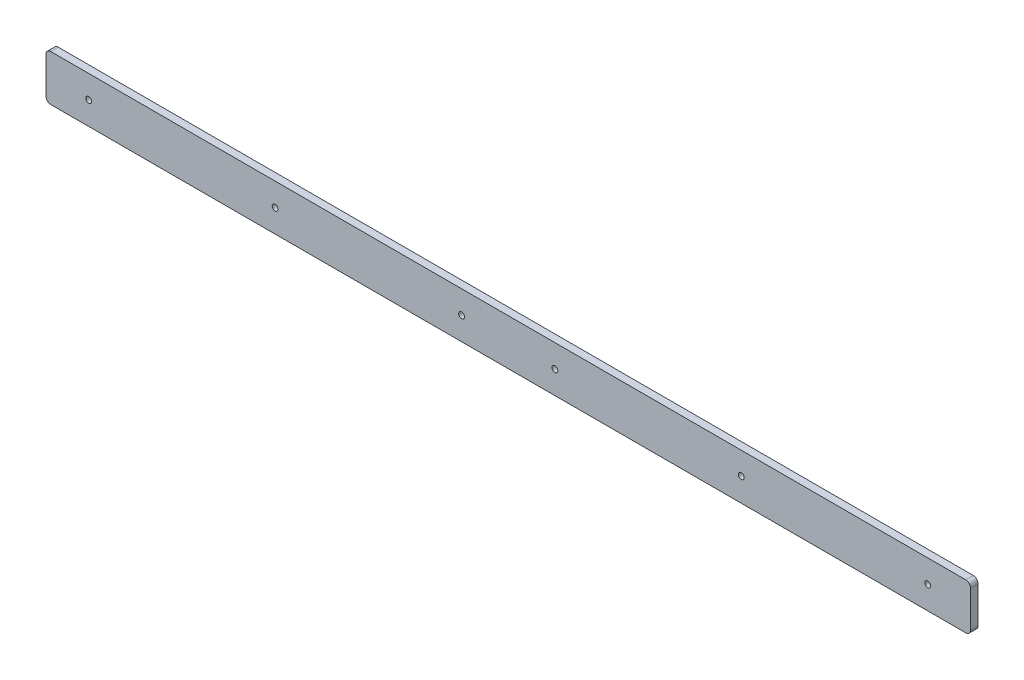
ISO-10303-21;
HEADER;
FILE_DESCRIPTION(('STEP AP214'),'2;1');
FILE_NAME('part.step','',(''),(''),'','','');
FILE_SCHEMA(('AUTOMOTIVE_DESIGN { 1 0 10303 214 1 1 1 1 }'));
ENDSEC;
DATA;
#1=APPLICATION_CONTEXT('core data for automotive mechanical design processes');
#2=APPLICATION_PROTOCOL_DEFINITION('international standard','automotive_design',2000,#1);
#3=PRODUCT_CONTEXT('',#1,'mechanical');
#4=PRODUCT('Part','Part','',(#3));
#5=PRODUCT_RELATED_PRODUCT_CATEGORY('part','',(#4));
#6=PRODUCT_DEFINITION_FORMATION('','',#4);
#7=PRODUCT_DEFINITION_CONTEXT('part definition',#1,'design');
#8=PRODUCT_DEFINITION('design','',#6,#7);
#9=PRODUCT_DEFINITION_SHAPE('','',#8);
#10=(LENGTH_UNIT() NAMED_UNIT(*) SI_UNIT(.MILLI.,.METRE.));
#11=(NAMED_UNIT(*) PLANE_ANGLE_UNIT() SI_UNIT($,.RADIAN.));
#12=(NAMED_UNIT(*) SI_UNIT($,.STERADIAN.) SOLID_ANGLE_UNIT());
#13=UNCERTAINTY_MEASURE_WITH_UNIT(LENGTH_MEASURE(1.E-05),#10,'distance_accuracy_value','');
#14=(GEOMETRIC_REPRESENTATION_CONTEXT(3) GLOBAL_UNCERTAINTY_ASSIGNED_CONTEXT((#13)) GLOBAL_UNIT_ASSIGNED_CONTEXT((#10,
#11,#12)) REPRESENTATION_CONTEXT('',''));
#15=CARTESIAN_POINT('',(0.,0.,0.));
#16=DIRECTION('',(0.,0.,1.));
#17=DIRECTION('',(1.,0.,0.));
#18=AXIS2_PLACEMENT_3D('',#15,#16,#17);
#19=CARTESIAN_POINT('',(0.,0.,1.6002));
#20=DIRECTION('',(-1.,0.,0.));
#21=DIRECTION('',(0.,0.,1.));
#22=AXIS2_PLACEMENT_3D('',#19,#20,#21);
#23=PLANE('',#22);
#24=DIRECTION('',(0.,1.,0.));
#25=VECTOR('',#24,1.);
#26=CARTESIAN_POINT('',(0.,0.,0.));
#27=LINE('',#26,#25);
#28=CARTESIAN_POINT('',(0.,1.,0.));
#29=VERTEX_POINT('',#28);
#30=CARTESIAN_POINT('',(0.,8.757695242,0.));
#31=VERTEX_POINT('',#30);
#32=EDGE_CURVE('E132',#29,#31,#27,.T.);
#33=ORIENTED_EDGE('',*,*,#32,.F.);
#34=DIRECTION('',(0.,0.,-1.));
#35=VECTOR('',#34,1.);
#36=CARTESIAN_POINT('',(0.,1.,1.6002));
#37=LINE('',#36,#35);
#38=CARTESIAN_POINT('',(0.,1.,1.6002));
#39=VERTEX_POINT('',#38);
#40=EDGE_CURVE('E11',#29,#39,#37,.F.);
#41=ORIENTED_EDGE('',*,*,#40,.T.);
#42=DIRECTION('',(0.,1.,0.));
#43=VECTOR('',#42,1.);
#44=CARTESIAN_POINT('',(0.,0.,1.6002));
#45=LINE('',#44,#43);
#46=CARTESIAN_POINT('',(0.,8.757695242,1.6002));
#47=VERTEX_POINT('',#46);
#48=EDGE_CURVE('E130',#39,#47,#45,.T.);
#49=ORIENTED_EDGE('',*,*,#48,.T.);
#50=DIRECTION('',(0.,0.,-1.));
#51=VECTOR('',#50,1.);
#52=CARTESIAN_POINT('',(0.,8.757695242,1.6002));
#53=LINE('',#52,#51);
#54=EDGE_CURVE('E44',#47,#31,#53,.T.);
#55=ORIENTED_EDGE('',*,*,#54,.T.);
#56=EDGE_LOOP('',(#33,#41,#49,#55));
#57=FACE_BOUND('',#56,.T.);
#58=ADVANCED_FACE('F36',(#57),#23,.T.);
#59=CARTESIAN_POINT('',(0.,0.,1.6002));
#60=DIRECTION('',(0.,1.,0.));
#61=DIRECTION('',(0.,0.,1.));
#62=AXIS2_PLACEMENT_3D('',#59,#60,#61);
#63=PLANE('',#62);
#64=DIRECTION('',(1.,0.,0.));
#65=VECTOR('',#64,1.);
#66=CARTESIAN_POINT('',(0.,0.,0.));
#67=LINE('',#66,#65);
#68=CARTESIAN_POINT('',(1.,0.,0.));
#69=VERTEX_POINT('',#68);
#70=CARTESIAN_POINT('',(195.457160044,0.,0.));
#71=VERTEX_POINT('',#70);
#72=EDGE_CURVE('E127',#69,#71,#67,.T.);
#73=ORIENTED_EDGE('',*,*,#72,.T.);
#74=DIRECTION('',(0.,0.,-1.));
#75=VECTOR('',#74,1.);
#76=CARTESIAN_POINT('',(195.457160044,0.,1.6002));
#77=LINE('',#76,#75);
#78=CARTESIAN_POINT('',(195.457160044,0.,1.6002));
#79=VERTEX_POINT('',#78);
#80=EDGE_CURVE('E107',#71,#79,#77,.F.);
#81=ORIENTED_EDGE('',*,*,#80,.T.);
#82=DIRECTION('',(1.,0.,0.));
#83=VECTOR('',#82,1.);
#84=CARTESIAN_POINT('',(0.,0.,1.6002));
#85=LINE('',#84,#83);
#86=CARTESIAN_POINT('',(1.,0.,1.6002));
#87=VERTEX_POINT('',#86);
#88=EDGE_CURVE('E136',#87,#79,#85,.T.);
#89=ORIENTED_EDGE('',*,*,#88,.F.);
#90=DIRECTION('',(0.,0.,-1.));
#91=VECTOR('',#90,1.);
#92=CARTESIAN_POINT('',(1.,0.,0.));
#93=LINE('',#92,#91);
#94=EDGE_CURVE('E112',#87,#69,#93,.T.);
#95=ORIENTED_EDGE('',*,*,#94,.T.);
#96=EDGE_LOOP('',(#73,#81,#89,#95));
#97=FACE_BOUND('',#96,.T.);
#98=ADVANCED_FACE('F229',(#97),#63,.F.);
#99=CARTESIAN_POINT('',(196.457160044,0.,1.6002));
#100=DIRECTION('',(-1.,0.,0.));
#101=DIRECTION('',(0.,0.,1.));
#102=AXIS2_PLACEMENT_3D('',#99,#100,#101);
#103=PLANE('',#102);
#104=DIRECTION('',(0.,1.,0.));
#105=VECTOR('',#104,1.);
#106=CARTESIAN_POINT('',(196.457160044,0.,1.6002));
#107=LINE('',#106,#105);
#108=CARTESIAN_POINT('',(196.457160044,1.,1.6002));
#109=VERTEX_POINT('',#108);
#110=CARTESIAN_POINT('',(196.457160044,8.757695242,1.6002));
#111=VERTEX_POINT('',#110);
#112=EDGE_CURVE('E121',#109,#111,#107,.T.);
#113=ORIENTED_EDGE('',*,*,#112,.F.);
#114=DIRECTION('',(0.,0.,-1.));
#115=VECTOR('',#114,1.);
#116=CARTESIAN_POINT('',(196.457160044,1.,1.6002));
#117=LINE('',#116,#115);
#118=CARTESIAN_POINT('',(196.457160044,1.,0.));
#119=VERTEX_POINT('',#118);
#120=EDGE_CURVE('E106',#109,#119,#117,.T.);
#121=ORIENTED_EDGE('',*,*,#120,.T.);
#122=DIRECTION('',(0.,1.,0.));
#123=VECTOR('',#122,1.);
#124=CARTESIAN_POINT('',(196.457160044,0.,0.));
#125=LINE('',#124,#123);
#126=CARTESIAN_POINT('',(196.457160044,8.757695242,0.));
#127=VERTEX_POINT('',#126);
#128=EDGE_CURVE('E119',#119,#127,#125,.T.);
#129=ORIENTED_EDGE('',*,*,#128,.T.);
#130=DIRECTION('',(0.,0.,-1.));
#131=VECTOR('',#130,1.);
#132=CARTESIAN_POINT('',(196.457160044,8.757695242,1.6002));
#133=LINE('',#132,#131);
#134=EDGE_CURVE('E123',#127,#111,#133,.F.);
#135=ORIENTED_EDGE('',*,*,#134,.T.);
#136=EDGE_LOOP('',(#113,#121,#129,#135));
#137=FACE_BOUND('',#136,.T.);
#138=ADVANCED_FACE('F118',(#137),#103,.F.);
#139=CARTESIAN_POINT('',(0.,9.757695242,1.6002));
#140=DIRECTION('',(0.,1.,0.));
#141=DIRECTION('',(0.,0.,1.));
#142=AXIS2_PLACEMENT_3D('',#139,#140,#141);
#143=PLANE('',#142);
#144=DIRECTION('',(1.,0.,0.));
#145=VECTOR('',#144,1.);
#146=CARTESIAN_POINT('',(0.,9.757695242,1.6002));
#147=LINE('',#146,#145);
#148=CARTESIAN_POINT('',(1.,9.757695242,1.6002));
#149=VERTEX_POINT('',#148);
#150=CARTESIAN_POINT('',(195.457160044,9.757695242,1.6002));
#151=VERTEX_POINT('',#150);
#152=EDGE_CURVE('E173',#149,#151,#147,.T.);
#153=ORIENTED_EDGE('',*,*,#152,.T.);
#154=DIRECTION('',(0.,0.,-1.));
#155=VECTOR('',#154,1.);
#156=CARTESIAN_POINT('',(195.457160044,9.757695242,0.));
#157=LINE('',#156,#155);
#158=CARTESIAN_POINT('',(195.457160044,9.757695242,0.));
#159=VERTEX_POINT('',#158);
#160=EDGE_CURVE('E153',#151,#159,#157,.T.);
#161=ORIENTED_EDGE('',*,*,#160,.T.);
#162=DIRECTION('',(1.,0.,0.));
#163=VECTOR('',#162,1.);
#164=CARTESIAN_POINT('',(0.,9.757695242,0.));
#165=LINE('',#164,#163);
#166=CARTESIAN_POINT('',(1.,9.757695242,0.));
#167=VERTEX_POINT('',#166);
#168=EDGE_CURVE('E128',#167,#159,#165,.T.);
#169=ORIENTED_EDGE('',*,*,#168,.F.);
#170=DIRECTION('',(0.,0.,-1.));
#171=VECTOR('',#170,1.);
#172=CARTESIAN_POINT('',(1.,9.757695242,1.6002));
#173=LINE('',#172,#171);
#174=EDGE_CURVE('E58',#167,#149,#173,.F.);
#175=ORIENTED_EDGE('',*,*,#174,.T.);
#176=EDGE_LOOP('',(#153,#161,#169,#175));
#177=FACE_BOUND('',#176,.T.);
#178=ADVANCED_FACE('F214',(#177),#143,.T.);
#179=CARTESIAN_POINT('',(0.,0.,1.6002));
#180=DIRECTION('',(0.,0.,-1.));
#181=DIRECTION('',(-1.,0.,0.));
#182=AXIS2_PLACEMENT_3D('',#179,#180,#181);
#183=PLANE('',#182);
#184=CARTESIAN_POINT('',(9.074999884,4.878847621,1.6002));
#185=DIRECTION('',(0.,0.,1.));
#186=DIRECTION('',(1.,0.,0.));
#187=AXIS2_PLACEMENT_3D('',#184,#185,#186);
#188=CIRCLE('',#187,0.625000000000001);
#189=CARTESIAN_POINT('',(9.699999884,4.878847621,1.6002));
#190=VERTEX_POINT('',#189);
#191=EDGE_CURVE('E167',#190,#190,#188,.T.);
#192=ORIENTED_EDGE('',*,*,#191,.F.);
#193=EDGE_LOOP('',(#192));
#194=FACE_BOUND('',#193,.T.);
#195=CARTESIAN_POINT('',(108.13416016,4.878847621,1.6002));
#196=DIRECTION('',(0.,0.,1.));
#197=DIRECTION('',(1.,0.,0.));
#198=AXIS2_PLACEMENT_3D('',#195,#196,#197);
#199=CIRCLE('',#198,0.62500002);
#200=CARTESIAN_POINT('',(108.75916018,4.878847621,1.6002));
#201=VERTEX_POINT('',#200);
#202=EDGE_CURVE('E201',#201,#201,#199,.T.);
#203=ORIENTED_EDGE('',*,*,#202,.F.);
#204=EDGE_LOOP('',(#203));
#205=FACE_BOUND('',#204,.T.);
#206=CARTESIAN_POINT('',(48.698999884,4.878847621,1.6002));
#207=DIRECTION('',(0.,0.,1.));
#208=DIRECTION('',(1.,0.,0.));
#209=AXIS2_PLACEMENT_3D('',#206,#207,#208);
#210=CIRCLE('',#209,0.624999999999999);
#211=CARTESIAN_POINT('',(49.323999884,4.878847621,1.6002));
#212=VERTEX_POINT('',#211);
#213=EDGE_CURVE('E183',#212,#212,#210,.T.);
#214=ORIENTED_EDGE('',*,*,#213,.F.);
#215=EDGE_LOOP('',(#214));
#216=FACE_BOUND('',#215,.T.);
#217=CARTESIAN_POINT('',(187.38216016,4.878847621,1.6002));
#218=DIRECTION('',(0.,0.,1.));
#219=DIRECTION('',(1.,0.,0.));
#220=AXIS2_PLACEMENT_3D('',#217,#218,#219);
#221=CIRCLE('',#220,0.625000019999999);
#222=CARTESIAN_POINT('',(188.00716018,4.878847621,1.6002));
#223=VERTEX_POINT('',#222);
#224=EDGE_CURVE('E176',#223,#223,#221,.T.);
#225=ORIENTED_EDGE('',*,*,#224,.F.);
#226=EDGE_LOOP('',(#225));
#227=FACE_BOUND('',#226,.T.);
#228=CARTESIAN_POINT('',(88.323000138,4.878847621,1.6002));
#229=DIRECTION('',(0.,0.,1.));
#230=DIRECTION('',(1.,0.,0.));
#231=AXIS2_PLACEMENT_3D('',#228,#229,#230);
#232=CIRCLE('',#231,0.625000000000006);
#233=CARTESIAN_POINT('',(88.948000138,4.878847621,1.6002));
#234=VERTEX_POINT('',#233);
#235=EDGE_CURVE('E196',#234,#234,#232,.T.);
#236=ORIENTED_EDGE('',*,*,#235,.F.);
#237=EDGE_LOOP('',(#236));
#238=FACE_BOUND('',#237,.T.);
#239=CARTESIAN_POINT('',(147.75816016,5.00253651629322,1.6002));
#240=DIRECTION('',(0.,0.,1.));
#241=DIRECTION('',(1.,0.,0.));
#242=AXIS2_PLACEMENT_3D('',#239,#240,#241);
#243=CIRCLE('',#242,0.625000019999999);
#244=CARTESIAN_POINT('',(148.38316018,5.00253651629322,1.6002));
#245=VERTEX_POINT('',#244);
#246=EDGE_CURVE('E189',#245,#245,#243,.T.);
#247=ORIENTED_EDGE('',*,*,#246,.F.);
#248=EDGE_LOOP('',(#247));
#249=FACE_BOUND('',#248,.T.);
#250=ORIENTED_EDGE('',*,*,#88,.T.);
#251=CARTESIAN_POINT('',(195.457160044,1.,1.6002));
#252=DIRECTION('',(0.,0.,-1.));
#253=DIRECTION('',(-1.,0.,0.));
#254=AXIS2_PLACEMENT_3D('',#251,#252,#253);
#255=CIRCLE('',#254,1.);
#256=EDGE_CURVE('E150',#79,#109,#255,.F.);
#257=ORIENTED_EDGE('',*,*,#256,.T.);
#258=ORIENTED_EDGE('',*,*,#112,.T.);
#259=CARTESIAN_POINT('',(195.457160044,8.757695242,1.6002));
#260=DIRECTION('',(0.,0.,-1.));
#261=DIRECTION('',(-1.,0.,0.));
#262=AXIS2_PLACEMENT_3D('',#259,#260,#261);
#263=CIRCLE('',#262,1.);
#264=EDGE_CURVE('E51',#111,#151,#263,.F.);
#265=ORIENTED_EDGE('',*,*,#264,.T.);
#266=ORIENTED_EDGE('',*,*,#152,.F.);
#267=CARTESIAN_POINT('',(1.,8.757695242,1.6002));
#268=DIRECTION('',(0.,0.,-1.));
#269=DIRECTION('',(-1.,0.,0.));
#270=AXIS2_PLACEMENT_3D('',#267,#268,#269);
#271=CIRCLE('',#270,1.);
#272=EDGE_CURVE('E145',#149,#47,#271,.F.);
#273=ORIENTED_EDGE('',*,*,#272,.T.);
#274=ORIENTED_EDGE('',*,*,#48,.F.);
#275=CARTESIAN_POINT('',(1.,1.,1.6002));
#276=DIRECTION('',(0.,0.,-1.));
#277=DIRECTION('',(-1.,0.,0.));
#278=AXIS2_PLACEMENT_3D('',#275,#276,#277);
#279=CIRCLE('',#278,1.);
#280=EDGE_CURVE('E147',#39,#87,#279,.F.);
#281=ORIENTED_EDGE('',*,*,#280,.T.);
#282=EDGE_LOOP('',(#250,#257,#258,#265,#266,#273,#274,#281));
#283=FACE_BOUND('',#282,.T.);
#284=ADVANCED_FACE('F211',(#194,#205,#216,#227,#238,#249,#283),#183,.F.);
#285=CARTESIAN_POINT('',(0.,0.,0.));
#286=DIRECTION('',(0.,0.,-1.));
#287=DIRECTION('',(-1.,0.,0.));
#288=AXIS2_PLACEMENT_3D('',#285,#286,#287);
#289=PLANE('',#288);
#290=CARTESIAN_POINT('',(9.074999884,4.878847621,0.));
#291=DIRECTION('',(0.,0.,1.));
#292=DIRECTION('',(1.,0.,0.));
#293=AXIS2_PLACEMENT_3D('',#290,#291,#292);
#294=CIRCLE('',#293,0.625000000000001);
#295=CARTESIAN_POINT('',(9.699999884,4.878847621,0.));
#296=VERTEX_POINT('',#295);
#297=EDGE_CURVE('E165',#296,#296,#294,.T.);
#298=ORIENTED_EDGE('',*,*,#297,.T.);
#299=EDGE_LOOP('',(#298));
#300=FACE_BOUND('',#299,.T.);
#301=CARTESIAN_POINT('',(108.13416016,4.878847621,0.));
#302=DIRECTION('',(0.,0.,1.));
#303=DIRECTION('',(1.,0.,0.));
#304=AXIS2_PLACEMENT_3D('',#301,#302,#303);
#305=CIRCLE('',#304,0.62500002);
#306=CARTESIAN_POINT('',(108.75916018,4.878847621,0.));
#307=VERTEX_POINT('',#306);
#308=EDGE_CURVE('E193',#307,#307,#305,.T.);
#309=ORIENTED_EDGE('',*,*,#308,.T.);
#310=EDGE_LOOP('',(#309));
#311=FACE_BOUND('',#310,.T.);
#312=CARTESIAN_POINT('',(48.698999884,4.878847621,0.));
#313=DIRECTION('',(0.,0.,1.));
#314=DIRECTION('',(1.,0.,0.));
#315=AXIS2_PLACEMENT_3D('',#312,#313,#314);
#316=CIRCLE('',#315,0.624999999999999);
#317=CARTESIAN_POINT('',(49.323999884,4.878847621,0.));
#318=VERTEX_POINT('',#317);
#319=EDGE_CURVE('E186',#318,#318,#316,.T.);
#320=ORIENTED_EDGE('',*,*,#319,.T.);
#321=EDGE_LOOP('',(#320));
#322=FACE_BOUND('',#321,.T.);
#323=CARTESIAN_POINT('',(187.38216016,4.878847621,0.));
#324=DIRECTION('',(0.,0.,1.));
#325=DIRECTION('',(1.,0.,0.));
#326=AXIS2_PLACEMENT_3D('',#323,#324,#325);
#327=CIRCLE('',#326,0.625000019999999);
#328=CARTESIAN_POINT('',(188.00716018,4.878847621,0.));
#329=VERTEX_POINT('',#328);
#330=EDGE_CURVE('E179',#329,#329,#327,.T.);
#331=ORIENTED_EDGE('',*,*,#330,.T.);
#332=EDGE_LOOP('',(#331));
#333=FACE_BOUND('',#332,.T.);
#334=CARTESIAN_POINT('',(88.323000138,4.878847621,0.));
#335=DIRECTION('',(0.,0.,1.));
#336=DIRECTION('',(1.,0.,0.));
#337=AXIS2_PLACEMENT_3D('',#334,#335,#336);
#338=CIRCLE('',#337,0.625000000000006);
#339=CARTESIAN_POINT('',(88.948000138,4.878847621,0.));
#340=VERTEX_POINT('',#339);
#341=EDGE_CURVE('E180',#340,#340,#338,.T.);
#342=ORIENTED_EDGE('',*,*,#341,.T.);
#343=EDGE_LOOP('',(#342));
#344=FACE_BOUND('',#343,.T.);
#345=CARTESIAN_POINT('',(147.75816016,5.00253651629322,0.));
#346=DIRECTION('',(0.,0.,1.));
#347=DIRECTION('',(1.,0.,0.));
#348=AXIS2_PLACEMENT_3D('',#345,#346,#347);
#349=CIRCLE('',#348,0.625000019999999);
#350=CARTESIAN_POINT('',(148.38316018,5.00253651629322,0.));
#351=VERTEX_POINT('',#350);
#352=EDGE_CURVE('E192',#351,#351,#349,.T.);
#353=ORIENTED_EDGE('',*,*,#352,.T.);
#354=EDGE_LOOP('',(#353));
#355=FACE_BOUND('',#354,.T.);
#356=ORIENTED_EDGE('',*,*,#128,.F.);
#357=CARTESIAN_POINT('',(195.457160044,1.,0.));
#358=DIRECTION('',(0.,0.,-1.));
#359=DIRECTION('',(-1.,0.,0.));
#360=AXIS2_PLACEMENT_3D('',#357,#358,#359);
#361=CIRCLE('',#360,1.);
#362=EDGE_CURVE('E102',#119,#71,#361,.T.);
#363=ORIENTED_EDGE('',*,*,#362,.T.);
#364=ORIENTED_EDGE('',*,*,#72,.F.);
#365=CARTESIAN_POINT('',(1.,1.,0.));
#366=DIRECTION('',(0.,0.,-1.));
#367=DIRECTION('',(-1.,0.,0.));
#368=AXIS2_PLACEMENT_3D('',#365,#366,#367);
#369=CIRCLE('',#368,1.);
#370=EDGE_CURVE('E139',#69,#29,#369,.T.);
#371=ORIENTED_EDGE('',*,*,#370,.T.);
#372=ORIENTED_EDGE('',*,*,#32,.T.);
#373=CARTESIAN_POINT('',(1.,8.757695242,0.));
#374=DIRECTION('',(0.,0.,-1.));
#375=DIRECTION('',(-1.,0.,0.));
#376=AXIS2_PLACEMENT_3D('',#373,#374,#375);
#377=CIRCLE('',#376,1.);
#378=EDGE_CURVE('E122',#31,#167,#377,.T.);
#379=ORIENTED_EDGE('',*,*,#378,.T.);
#380=ORIENTED_EDGE('',*,*,#168,.T.);
#381=CARTESIAN_POINT('',(195.457160044,8.757695242,0.));
#382=DIRECTION('',(0.,0.,-1.));
#383=DIRECTION('',(-1.,0.,0.));
#384=AXIS2_PLACEMENT_3D('',#381,#382,#383);
#385=CIRCLE('',#384,1.);
#386=EDGE_CURVE('E113',#159,#127,#385,.T.);
#387=ORIENTED_EDGE('',*,*,#386,.T.);
#388=EDGE_LOOP('',(#356,#363,#364,#371,#372,#379,#380,#387));
#389=FACE_BOUND('',#388,.T.);
#390=ADVANCED_FACE('F125',(#300,#311,#322,#333,#344,#355,#389),#289,.T.);
#391=CARTESIAN_POINT('',(147.75816016,5.00253651629322,0.));
#392=DIRECTION('',(0.,0.,1.));
#393=DIRECTION('',(1.,0.,0.));
#394=AXIS2_PLACEMENT_3D('',#391,#392,#393);
#395=CYLINDRICAL_SURFACE('',#394,0.625000019999999);
#396=ORIENTED_EDGE('',*,*,#352,.F.);
#397=EDGE_LOOP('',(#396));
#398=FACE_BOUND('',#397,.T.);
#399=ORIENTED_EDGE('',*,*,#246,.T.);
#400=EDGE_LOOP('',(#399));
#401=FACE_BOUND('',#400,.T.);
#402=ADVANCED_FACE('F261',(#398,#401),#395,.F.);
#403=CARTESIAN_POINT('',(88.323000138,4.878847621,0.));
#404=DIRECTION('',(0.,0.,1.));
#405=DIRECTION('',(1.,0.,0.));
#406=AXIS2_PLACEMENT_3D('',#403,#404,#405);
#407=CYLINDRICAL_SURFACE('',#406,0.625000000000006);
#408=ORIENTED_EDGE('',*,*,#341,.F.);
#409=EDGE_LOOP('',(#408));
#410=FACE_BOUND('',#409,.T.);
#411=ORIENTED_EDGE('',*,*,#235,.T.);
#412=EDGE_LOOP('',(#411));
#413=FACE_BOUND('',#412,.T.);
#414=ADVANCED_FACE('F268',(#410,#413),#407,.F.);
#415=CARTESIAN_POINT('',(187.38216016,4.878847621,0.));
#416=DIRECTION('',(0.,0.,1.));
#417=DIRECTION('',(1.,0.,0.));
#418=AXIS2_PLACEMENT_3D('',#415,#416,#417);
#419=CYLINDRICAL_SURFACE('',#418,0.625000019999999);
#420=ORIENTED_EDGE('',*,*,#330,.F.);
#421=EDGE_LOOP('',(#420));
#422=FACE_BOUND('',#421,.T.);
#423=ORIENTED_EDGE('',*,*,#224,.T.);
#424=EDGE_LOOP('',(#423));
#425=FACE_BOUND('',#424,.T.);
#426=ADVANCED_FACE('F264',(#422,#425),#419,.F.);
#427=CARTESIAN_POINT('',(48.698999884,4.878847621,0.));
#428=DIRECTION('',(0.,0.,1.));
#429=DIRECTION('',(1.,0.,0.));
#430=AXIS2_PLACEMENT_3D('',#427,#428,#429);
#431=CYLINDRICAL_SURFACE('',#430,0.624999999999999);
#432=ORIENTED_EDGE('',*,*,#319,.F.);
#433=EDGE_LOOP('',(#432));
#434=FACE_BOUND('',#433,.T.);
#435=ORIENTED_EDGE('',*,*,#213,.T.);
#436=EDGE_LOOP('',(#435));
#437=FACE_BOUND('',#436,.T.);
#438=ADVANCED_FACE('F267',(#434,#437),#431,.F.);
#439=CARTESIAN_POINT('',(108.13416016,4.878847621,0.));
#440=DIRECTION('',(0.,0.,1.));
#441=DIRECTION('',(1.,0.,0.));
#442=AXIS2_PLACEMENT_3D('',#439,#440,#441);
#443=CYLINDRICAL_SURFACE('',#442,0.62500002);
#444=ORIENTED_EDGE('',*,*,#308,.F.);
#445=EDGE_LOOP('',(#444));
#446=FACE_BOUND('',#445,.T.);
#447=ORIENTED_EDGE('',*,*,#202,.T.);
#448=EDGE_LOOP('',(#447));
#449=FACE_BOUND('',#448,.T.);
#450=ADVANCED_FACE('F272',(#446,#449),#443,.F.);
#451=CARTESIAN_POINT('',(9.074999884,4.878847621,0.));
#452=DIRECTION('',(0.,0.,1.));
#453=DIRECTION('',(1.,0.,0.));
#454=AXIS2_PLACEMENT_3D('',#451,#452,#453);
#455=CYLINDRICAL_SURFACE('',#454,0.625000000000001);
#456=ORIENTED_EDGE('',*,*,#297,.F.);
#457=EDGE_LOOP('',(#456));
#458=FACE_BOUND('',#457,.T.);
#459=ORIENTED_EDGE('',*,*,#191,.T.);
#460=EDGE_LOOP('',(#459));
#461=FACE_BOUND('',#460,.T.);
#462=ADVANCED_FACE('F209',(#458,#461),#455,.F.);
#463=CARTESIAN_POINT('',(195.457160044,1.,1.6002));
#464=DIRECTION('',(0.,0.,-1.));
#465=DIRECTION('',(-1.,0.,0.));
#466=AXIS2_PLACEMENT_3D('',#463,#464,#465);
#467=CYLINDRICAL_SURFACE('',#466,1.);
#468=ORIENTED_EDGE('',*,*,#256,.F.);
#469=ORIENTED_EDGE('',*,*,#80,.F.);
#470=ORIENTED_EDGE('',*,*,#362,.F.);
#471=ORIENTED_EDGE('',*,*,#120,.F.);
#472=EDGE_LOOP('',(#468,#469,#470,#471));
#473=FACE_BOUND('',#472,.T.);
#474=ADVANCED_FACE('F105',(#473),#467,.T.);
#475=CARTESIAN_POINT('',(195.457160044,8.757695242,1.6002));
#476=DIRECTION('',(0.,0.,1.));
#477=DIRECTION('',(1.,0.,0.));
#478=AXIS2_PLACEMENT_3D('',#475,#476,#477);
#479=CYLINDRICAL_SURFACE('',#478,1.);
#480=ORIENTED_EDGE('',*,*,#264,.F.);
#481=ORIENTED_EDGE('',*,*,#134,.F.);
#482=ORIENTED_EDGE('',*,*,#386,.F.);
#483=ORIENTED_EDGE('',*,*,#160,.F.);
#484=EDGE_LOOP('',(#480,#481,#482,#483));
#485=FACE_BOUND('',#484,.T.);
#486=ADVANCED_FACE('F236',(#485),#479,.T.);
#487=CARTESIAN_POINT('',(1.,1.,1.6002));
#488=DIRECTION('',(0.,0.,1.));
#489=DIRECTION('',(1.,0.,0.));
#490=AXIS2_PLACEMENT_3D('',#487,#488,#489);
#491=CYLINDRICAL_SURFACE('',#490,1.);
#492=ORIENTED_EDGE('',*,*,#280,.F.);
#493=ORIENTED_EDGE('',*,*,#40,.F.);
#494=ORIENTED_EDGE('',*,*,#370,.F.);
#495=ORIENTED_EDGE('',*,*,#94,.F.);
#496=EDGE_LOOP('',(#492,#493,#494,#495));
#497=FACE_BOUND('',#496,.T.);
#498=ADVANCED_FACE('F231',(#497),#491,.T.);
#499=CARTESIAN_POINT('',(1.,8.757695242,1.6002));
#500=DIRECTION('',(0.,0.,-1.));
#501=DIRECTION('',(-1.,0.,0.));
#502=AXIS2_PLACEMENT_3D('',#499,#500,#501);
#503=CYLINDRICAL_SURFACE('',#502,1.);
#504=ORIENTED_EDGE('',*,*,#272,.F.);
#505=ORIENTED_EDGE('',*,*,#174,.F.);
#506=ORIENTED_EDGE('',*,*,#378,.F.);
#507=ORIENTED_EDGE('',*,*,#54,.F.);
#508=EDGE_LOOP('',(#504,#505,#506,#507));
#509=FACE_BOUND('',#508,.T.);
#510=ADVANCED_FACE('F38',(#509),#503,.T.);
#511=CLOSED_SHELL('',(#58,#98,#138,#178,#284,#390,#402,#414,#426,#438,#450,#462,#474,#486,#498,#510));
#512=MANIFOLD_SOLID_BREP('B2',#511);
#513=ADVANCED_BREP_SHAPE_REPRESENTATION('',(#18,#512),#14);
#514=SHAPE_DEFINITION_REPRESENTATION(#9,#513);
ENDSEC;
END-ISO-10303-21;
